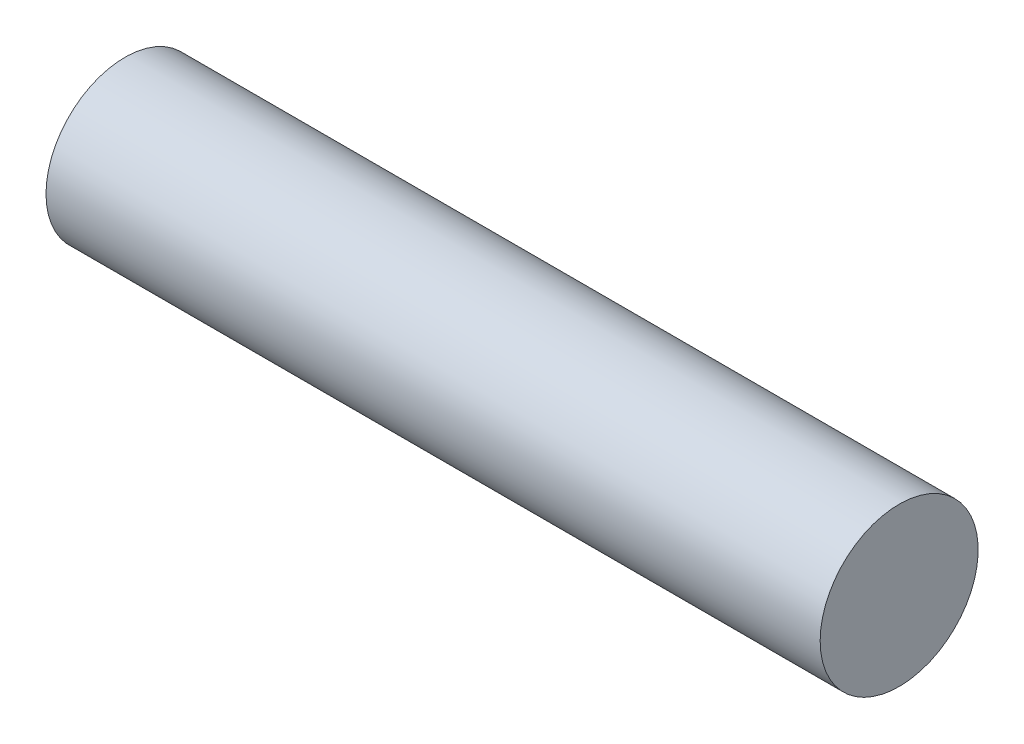
ISO-10303-21;
HEADER;
FILE_DESCRIPTION(('STEP AP214'),'2;1');
FILE_NAME('part.step','',(''),(''),'','','');
FILE_SCHEMA(('AUTOMOTIVE_DESIGN { 1 0 10303 214 1 1 1 1 }'));
ENDSEC;
DATA;
#1=APPLICATION_CONTEXT('core data for automotive mechanical design processes');
#2=APPLICATION_PROTOCOL_DEFINITION('international standard','automotive_design',2000,#1);
#3=PRODUCT_CONTEXT('',#1,'mechanical');
#4=PRODUCT('Part','Part','',(#3));
#5=PRODUCT_RELATED_PRODUCT_CATEGORY('part','',(#4));
#6=PRODUCT_DEFINITION_FORMATION('','',#4);
#7=PRODUCT_DEFINITION_CONTEXT('part definition',#1,'design');
#8=PRODUCT_DEFINITION('design','',#6,#7);
#9=PRODUCT_DEFINITION_SHAPE('','',#8);
#10=(LENGTH_UNIT() NAMED_UNIT(*) SI_UNIT(.MILLI.,.METRE.));
#11=(NAMED_UNIT(*) PLANE_ANGLE_UNIT() SI_UNIT($,.RADIAN.));
#12=(NAMED_UNIT(*) SI_UNIT($,.STERADIAN.) SOLID_ANGLE_UNIT());
#13=UNCERTAINTY_MEASURE_WITH_UNIT(LENGTH_MEASURE(1.E-05),#10,'distance_accuracy_value','');
#14=(GEOMETRIC_REPRESENTATION_CONTEXT(3) GLOBAL_UNCERTAINTY_ASSIGNED_CONTEXT((#13)) GLOBAL_UNIT_ASSIGNED_CONTEXT((#10,
#11,#12)) REPRESENTATION_CONTEXT('',''));
#15=CARTESIAN_POINT('',(0.,0.,0.));
#16=DIRECTION('',(0.,0.,1.));
#17=DIRECTION('',(1.,0.,0.));
#18=AXIS2_PLACEMENT_3D('',#15,#16,#17);
#19=CARTESIAN_POINT('',(0.,5.,0.));
#20=DIRECTION('',(1.,0.,0.));
#21=DIRECTION('',(0.,0.,-1.));
#22=AXIS2_PLACEMENT_3D('',#19,#20,#21);
#23=PLANE('',#22);
#24=CARTESIAN_POINT('',(0.,0.,0.));
#25=DIRECTION('',(-1.,0.,0.));
#26=DIRECTION('',(0.,0.,1.));
#27=AXIS2_PLACEMENT_3D('',#24,#25,#26);
#28=CIRCLE('',#27,5.);
#29=CARTESIAN_POINT('',(0.,0.,5.));
#30=VERTEX_POINT('',#29);
#31=EDGE_CURVE('E41',#30,#30,#28,.T.);
#32=ORIENTED_EDGE('',*,*,#31,.T.);
#33=EDGE_LOOP('',(#32));
#34=FACE_BOUND('',#33,.T.);
#35=ADVANCED_FACE('F35',(#34),#23,.F.);
#36=CARTESIAN_POINT('',(49.,0.,0.));
#37=DIRECTION('',(-1.,0.,0.));
#38=DIRECTION('',(0.,0.,1.));
#39=AXIS2_PLACEMENT_3D('',#36,#37,#38);
#40=PLANE('',#39);
#41=CARTESIAN_POINT('',(49.,0.,0.));
#42=DIRECTION('',(-1.,0.,0.));
#43=DIRECTION('',(0.,0.,1.));
#44=AXIS2_PLACEMENT_3D('',#41,#42,#43);
#45=CIRCLE('',#44,5.);
#46=CARTESIAN_POINT('',(49.,0.,5.));
#47=VERTEX_POINT('',#46);
#48=EDGE_CURVE('E10',#47,#47,#45,.T.);
#49=ORIENTED_EDGE('',*,*,#48,.F.);
#50=EDGE_LOOP('',(#49));
#51=FACE_BOUND('',#50,.T.);
#52=ADVANCED_FACE('F50',(#51),#40,.F.);
#53=CARTESIAN_POINT('',(0.,0.,0.));
#54=DIRECTION('',(-1.,0.,0.));
#55=DIRECTION('',(0.,0.,1.));
#56=AXIS2_PLACEMENT_3D('',#53,#54,#55);
#57=CYLINDRICAL_SURFACE('',#56,5.);
#58=ORIENTED_EDGE('',*,*,#31,.F.);
#59=EDGE_LOOP('',(#58));
#60=FACE_BOUND('',#59,.T.);
#61=ORIENTED_EDGE('',*,*,#48,.T.);
#62=EDGE_LOOP('',(#61));
#63=FACE_BOUND('',#62,.T.);
#64=ADVANCED_FACE('F48',(#60,#63),#57,.T.);
#65=CLOSED_SHELL('',(#35,#52,#64));
#66=MANIFOLD_SOLID_BREP('B2',#65);
#67=ADVANCED_BREP_SHAPE_REPRESENTATION('',(#18,#66),#14);
#68=SHAPE_DEFINITION_REPRESENTATION(#9,#67);
ENDSEC;
END-ISO-10303-21;
